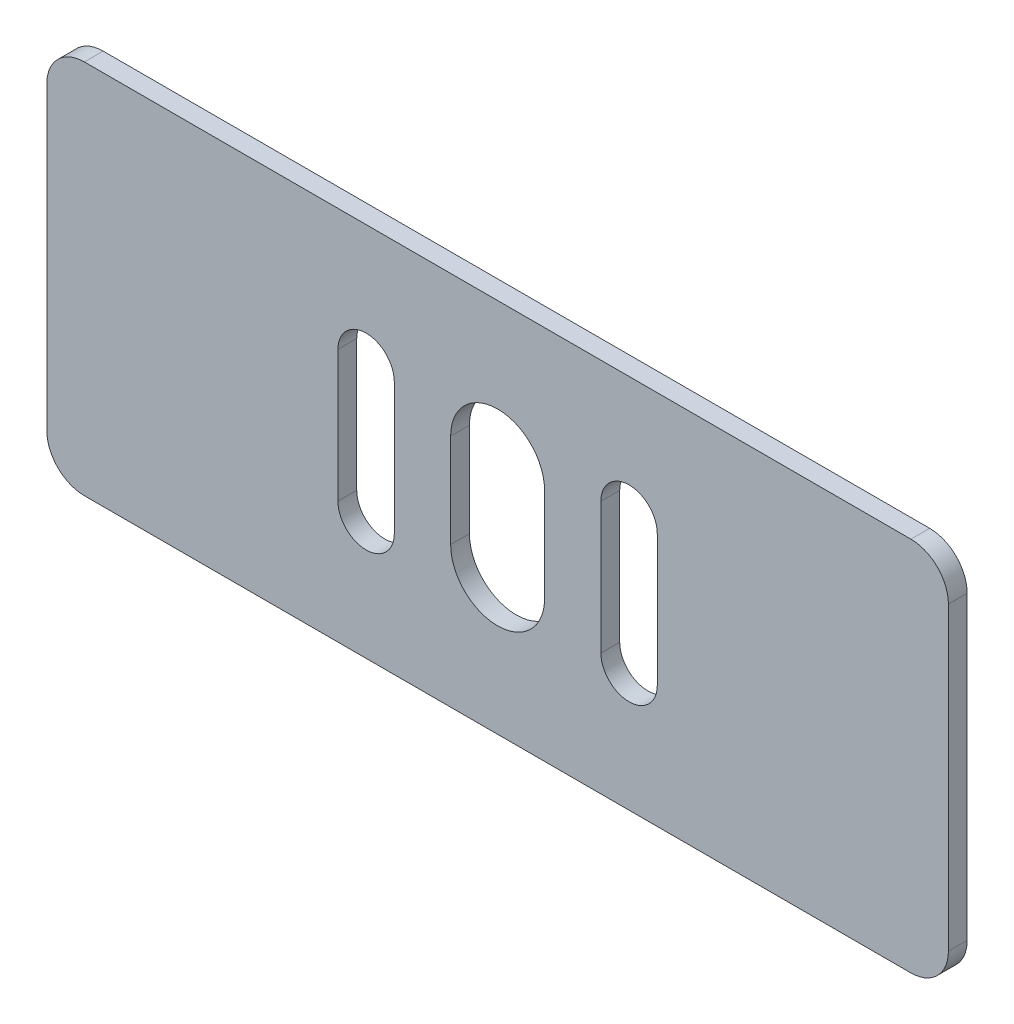
ISO-10303-21;
HEADER;
FILE_DESCRIPTION(('STEP AP214'),'2;1');
FILE_NAME('part.step','',(''),(''),'','','');
FILE_SCHEMA(('AUTOMOTIVE_DESIGN { 1 0 10303 214 1 1 1 1 }'));
ENDSEC;
DATA;
#1=APPLICATION_CONTEXT('core data for automotive mechanical design processes');
#2=APPLICATION_PROTOCOL_DEFINITION('international standard','automotive_design',2000,#1);
#3=PRODUCT_CONTEXT('',#1,'mechanical');
#4=PRODUCT('Part','Part','',(#3));
#5=PRODUCT_RELATED_PRODUCT_CATEGORY('part','',(#4));
#6=PRODUCT_DEFINITION_FORMATION('','',#4);
#7=PRODUCT_DEFINITION_CONTEXT('part definition',#1,'design');
#8=PRODUCT_DEFINITION('design','',#6,#7);
#9=PRODUCT_DEFINITION_SHAPE('','',#8);
#10=(LENGTH_UNIT() NAMED_UNIT(*) SI_UNIT(.MILLI.,.METRE.));
#11=(NAMED_UNIT(*) PLANE_ANGLE_UNIT() SI_UNIT($,.RADIAN.));
#12=(NAMED_UNIT(*) SI_UNIT($,.STERADIAN.) SOLID_ANGLE_UNIT());
#13=UNCERTAINTY_MEASURE_WITH_UNIT(LENGTH_MEASURE(1.E-05),#10,'distance_accuracy_value','');
#14=(GEOMETRIC_REPRESENTATION_CONTEXT(3) GLOBAL_UNCERTAINTY_ASSIGNED_CONTEXT((#13)) GLOBAL_UNIT_ASSIGNED_CONTEXT((#10,
#11,#12)) REPRESENTATION_CONTEXT('',''));
#15=CARTESIAN_POINT('',(0.,0.,0.));
#16=DIRECTION('',(0.,0.,1.));
#17=DIRECTION('',(1.,0.,0.));
#18=AXIS2_PLACEMENT_3D('',#15,#16,#17);
#19=CARTESIAN_POINT('',(-22.,8.,0.5));
#20=DIRECTION('',(0.,0.,1.));
#21=DIRECTION('',(1.,0.,0.));
#22=AXIS2_PLACEMENT_3D('',#19,#20,#21);
#23=PLANE('',#22);
#24=CARTESIAN_POINT('',(-22.,8.,0.5));
#25=DIRECTION('',(0.,0.,1.));
#26=DIRECTION('',(1.,0.,0.));
#27=AXIS2_PLACEMENT_3D('',#24,#25,#26);
#28=CIRCLE('',#27,2.);
#29=CARTESIAN_POINT('',(-22.,10.,0.5));
#30=VERTEX_POINT('',#29);
#31=CARTESIAN_POINT('',(-24.,7.99999999999998,0.5));
#32=VERTEX_POINT('',#31);
#33=EDGE_CURVE('E315',#30,#32,#28,.T.);
#34=ORIENTED_EDGE('',*,*,#33,.T.);
#35=DIRECTION('',(0.,-1.,0.));
#36=VECTOR('',#35,1.);
#37=CARTESIAN_POINT('',(-24.,-7.99999999999999,0.5));
#38=LINE('',#37,#36);
#39=CARTESIAN_POINT('',(-24.,-8.,0.5));
#40=VERTEX_POINT('',#39);
#41=EDGE_CURVE('E319',#32,#40,#38,.T.);
#42=ORIENTED_EDGE('',*,*,#41,.T.);
#43=CARTESIAN_POINT('',(-22.,-8.,0.5));
#44=DIRECTION('',(0.,0.,1.));
#45=DIRECTION('',(-1.,0.,0.));
#46=AXIS2_PLACEMENT_3D('',#43,#44,#45);
#47=CIRCLE('',#46,2.);
#48=CARTESIAN_POINT('',(-22.,-10.,0.5));
#49=VERTEX_POINT('',#48);
#50=EDGE_CURVE('E323',#40,#49,#47,.T.);
#51=ORIENTED_EDGE('',*,*,#50,.T.);
#52=DIRECTION('',(1.,0.,0.));
#53=VECTOR('',#52,1.);
#54=CARTESIAN_POINT('',(22.,-10.,0.5));
#55=LINE('',#54,#53);
#56=CARTESIAN_POINT('',(22.,-9.99999999999999,0.5));
#57=VERTEX_POINT('',#56);
#58=EDGE_CURVE('E326',#49,#57,#55,.T.);
#59=ORIENTED_EDGE('',*,*,#58,.T.);
#60=CARTESIAN_POINT('',(22.,-8.,0.5));
#61=DIRECTION('',(0.,0.,1.));
#62=DIRECTION('',(1.,0.,0.));
#63=AXIS2_PLACEMENT_3D('',#60,#61,#62);
#64=CIRCLE('',#63,2.);
#65=CARTESIAN_POINT('',(24.,-7.99999999999998,0.5));
#66=VERTEX_POINT('',#65);
#67=EDGE_CURVE('E329',#57,#66,#64,.T.);
#68=ORIENTED_EDGE('',*,*,#67,.T.);
#69=DIRECTION('',(0.,1.,0.));
#70=VECTOR('',#69,1.);
#71=CARTESIAN_POINT('',(24.,-7.99999999999998,0.5));
#72=LINE('',#71,#70);
#73=CARTESIAN_POINT('',(24.,7.99999999999999,0.5));
#74=VERTEX_POINT('',#73);
#75=EDGE_CURVE('E332',#66,#74,#72,.T.);
#76=ORIENTED_EDGE('',*,*,#75,.T.);
#77=CARTESIAN_POINT('',(22.,8.,0.5));
#78=DIRECTION('',(0.,0.,1.));
#79=DIRECTION('',(1.,0.,0.));
#80=AXIS2_PLACEMENT_3D('',#77,#78,#79);
#81=CIRCLE('',#80,2.);
#82=CARTESIAN_POINT('',(22.,10.,0.5));
#83=VERTEX_POINT('',#82);
#84=EDGE_CURVE('E335',#74,#83,#81,.T.);
#85=ORIENTED_EDGE('',*,*,#84,.T.);
#86=DIRECTION('',(-1.,0.,0.));
#87=VECTOR('',#86,1.);
#88=CARTESIAN_POINT('',(22.,10.,0.5));
#89=LINE('',#88,#87);
#90=EDGE_CURVE('E338',#83,#30,#89,.T.);
#91=ORIENTED_EDGE('',*,*,#90,.T.);
#92=EDGE_LOOP('',(#34,#42,#51,#59,#68,#76,#85,#91));
#93=FACE_BOUND('',#92,.T.);
#94=DIRECTION('',(0.,1.,0.));
#95=VECTOR('',#94,1.);
#96=CARTESIAN_POINT('',(2.50000000000001,-2.5,0.5));
#97=LINE('',#96,#95);
#98=CARTESIAN_POINT('',(2.50000000000001,-2.5,0.5));
#99=VERTEX_POINT('',#98);
#100=CARTESIAN_POINT('',(2.50000000000001,2.5,0.5));
#101=VERTEX_POINT('',#100);
#102=EDGE_CURVE('E275',#99,#101,#97,.T.);
#103=ORIENTED_EDGE('',*,*,#102,.F.);
#104=CARTESIAN_POINT('',(0.,-2.5,0.5));
#105=DIRECTION('',(0.,0.,1.));
#106=DIRECTION('',(1.,0.,0.));
#107=AXIS2_PLACEMENT_3D('',#104,#105,#106);
#108=CIRCLE('',#107,2.5);
#109=CARTESIAN_POINT('',(-2.49999999999999,-2.5,0.5));
#110=VERTEX_POINT('',#109);
#111=EDGE_CURVE('E272',#110,#99,#108,.T.);
#112=ORIENTED_EDGE('',*,*,#111,.F.);
#113=DIRECTION('',(0.,-1.,0.));
#114=VECTOR('',#113,1.);
#115=CARTESIAN_POINT('',(-2.49999999999999,-2.5,0.5));
#116=LINE('',#115,#114);
#117=CARTESIAN_POINT('',(-2.49999999999999,2.5,0.5));
#118=VERTEX_POINT('',#117);
#119=EDGE_CURVE('E283',#118,#110,#116,.T.);
#120=ORIENTED_EDGE('',*,*,#119,.F.);
#121=CARTESIAN_POINT('',(0.,2.5,0.5));
#122=DIRECTION('',(0.,0.,1.));
#123=DIRECTION('',(1.,0.,0.));
#124=AXIS2_PLACEMENT_3D('',#121,#122,#123);
#125=CIRCLE('',#124,2.5);
#126=EDGE_CURVE('E279',#101,#118,#125,.T.);
#127=ORIENTED_EDGE('',*,*,#126,.F.);
#128=EDGE_LOOP('',(#103,#112,#120,#127));
#129=FACE_BOUND('',#128,.T.);
#130=DIRECTION('',(0.,1.,0.));
#131=VECTOR('',#130,1.);
#132=CARTESIAN_POINT('',(-5.49999999999999,-3.5,0.5));
#133=LINE('',#132,#131);
#134=CARTESIAN_POINT('',(-5.49999999999999,-3.5,0.5));
#135=VERTEX_POINT('',#134);
#136=CARTESIAN_POINT('',(-5.49999999999999,3.5,0.5));
#137=VERTEX_POINT('',#136);
#138=EDGE_CURVE('E232',#135,#137,#133,.T.);
#139=ORIENTED_EDGE('',*,*,#138,.F.);
#140=CARTESIAN_POINT('',(-6.99999999999999,-3.5,0.5));
#141=DIRECTION('',(0.,0.,1.));
#142=DIRECTION('',(1.,0.,0.));
#143=AXIS2_PLACEMENT_3D('',#140,#141,#142);
#144=CIRCLE('',#143,1.5);
#145=CARTESIAN_POINT('',(-8.49999999999999,-3.5,0.5));
#146=VERTEX_POINT('',#145);
#147=EDGE_CURVE('E229',#146,#135,#144,.T.);
#148=ORIENTED_EDGE('',*,*,#147,.F.);
#149=DIRECTION('',(0.,-1.,0.));
#150=VECTOR('',#149,1.);
#151=CARTESIAN_POINT('',(-8.49999999999999,-3.5,0.5));
#152=LINE('',#151,#150);
#153=CARTESIAN_POINT('',(-8.49999999999999,3.5,0.5));
#154=VERTEX_POINT('',#153);
#155=EDGE_CURVE('E240',#154,#146,#152,.T.);
#156=ORIENTED_EDGE('',*,*,#155,.F.);
#157=CARTESIAN_POINT('',(-6.99999999999999,3.5,0.5));
#158=DIRECTION('',(0.,0.,1.));
#159=DIRECTION('',(1.,0.,0.));
#160=AXIS2_PLACEMENT_3D('',#157,#158,#159);
#161=CIRCLE('',#160,1.5);
#162=EDGE_CURVE('E236',#137,#154,#161,.T.);
#163=ORIENTED_EDGE('',*,*,#162,.F.);
#164=EDGE_LOOP('',(#139,#148,#156,#163));
#165=FACE_BOUND('',#164,.T.);
#166=DIRECTION('',(0.,1.,0.));
#167=VECTOR('',#166,1.);
#168=CARTESIAN_POINT('',(8.5,-3.5,0.5));
#169=LINE('',#168,#167);
#170=CARTESIAN_POINT('',(8.5,-3.5,0.5));
#171=VERTEX_POINT('',#170);
#172=CARTESIAN_POINT('',(8.5,3.5,0.5));
#173=VERTEX_POINT('',#172);
#174=EDGE_CURVE('E190',#171,#173,#169,.T.);
#175=ORIENTED_EDGE('',*,*,#174,.F.);
#176=CARTESIAN_POINT('',(7.,-3.5,0.5));
#177=DIRECTION('',(0.,0.,1.));
#178=DIRECTION('',(1.,0.,0.));
#179=AXIS2_PLACEMENT_3D('',#176,#177,#178);
#180=CIRCLE('',#179,1.5);
#181=CARTESIAN_POINT('',(5.5,-3.5,0.5));
#182=VERTEX_POINT('',#181);
#183=EDGE_CURVE('E181',#182,#171,#180,.T.);
#184=ORIENTED_EDGE('',*,*,#183,.F.);
#185=DIRECTION('',(0.,-1.,0.));
#186=VECTOR('',#185,1.);
#187=CARTESIAN_POINT('',(5.5,-3.5,0.5));
#188=LINE('',#187,#186);
#189=CARTESIAN_POINT('',(5.50000000000001,3.5,0.5));
#190=VERTEX_POINT('',#189);
#191=EDGE_CURVE('E207',#190,#182,#188,.T.);
#192=ORIENTED_EDGE('',*,*,#191,.F.);
#193=CARTESIAN_POINT('',(7.,3.5,0.5));
#194=DIRECTION('',(0.,0.,1.));
#195=DIRECTION('',(1.,0.,0.));
#196=AXIS2_PLACEMENT_3D('',#193,#194,#195);
#197=CIRCLE('',#196,1.5);
#198=EDGE_CURVE('E203',#173,#190,#197,.T.);
#199=ORIENTED_EDGE('',*,*,#198,.F.);
#200=EDGE_LOOP('',(#175,#184,#192,#199));
#201=FACE_BOUND('',#200,.T.);
#202=ADVANCED_FACE('F43',(#93,#129,#165,#201),#23,.T.);
#203=CARTESIAN_POINT('',(-22.,8.,-0.5));
#204=DIRECTION('',(0.,0.,1.));
#205=DIRECTION('',(1.,0.,0.));
#206=AXIS2_PLACEMENT_3D('',#203,#204,#205);
#207=PLANE('',#206);
#208=CARTESIAN_POINT('',(-6.99999999999999,-3.5,-0.5));
#209=DIRECTION('',(0.,0.,1.));
#210=DIRECTION('',(1.,0.,0.));
#211=AXIS2_PLACEMENT_3D('',#208,#209,#210);
#212=CIRCLE('',#211,1.5);
#213=CARTESIAN_POINT('',(-8.49999999999999,-3.5,-0.5));
#214=VERTEX_POINT('',#213);
#215=CARTESIAN_POINT('',(-5.49999999999999,-3.5,-0.5));
#216=VERTEX_POINT('',#215);
#217=EDGE_CURVE('E199',#214,#216,#212,.T.);
#218=ORIENTED_EDGE('',*,*,#217,.T.);
#219=DIRECTION('',(0.,1.,0.));
#220=VECTOR('',#219,1.);
#221=CARTESIAN_POINT('',(-5.49999999999999,-3.5,-0.5));
#222=LINE('',#221,#220);
#223=CARTESIAN_POINT('',(-5.49999999999999,3.5,-0.5));
#224=VERTEX_POINT('',#223);
#225=EDGE_CURVE('E247',#216,#224,#222,.T.);
#226=ORIENTED_EDGE('',*,*,#225,.T.);
#227=CARTESIAN_POINT('',(-6.99999999999999,3.5,-0.5));
#228=DIRECTION('',(0.,0.,1.));
#229=DIRECTION('',(1.,0.,0.));
#230=AXIS2_PLACEMENT_3D('',#227,#228,#229);
#231=CIRCLE('',#230,1.5);
#232=CARTESIAN_POINT('',(-8.49999999999999,3.5,-0.5));
#233=VERTEX_POINT('',#232);
#234=EDGE_CURVE('E251',#224,#233,#231,.T.);
#235=ORIENTED_EDGE('',*,*,#234,.T.);
#236=DIRECTION('',(0.,-1.,0.));
#237=VECTOR('',#236,1.);
#238=CARTESIAN_POINT('',(-8.49999999999999,-3.5,-0.5));
#239=LINE('',#238,#237);
#240=EDGE_CURVE('E233',#233,#214,#239,.T.);
#241=ORIENTED_EDGE('',*,*,#240,.T.);
#242=EDGE_LOOP('',(#218,#226,#235,#241));
#243=FACE_BOUND('',#242,.T.);
#244=CARTESIAN_POINT('',(-22.,8.,-0.5));
#245=DIRECTION('',(0.,0.,1.));
#246=DIRECTION('',(1.,0.,0.));
#247=AXIS2_PLACEMENT_3D('',#244,#245,#246);
#248=CIRCLE('',#247,2.);
#249=CARTESIAN_POINT('',(-22.,10.,-0.5));
#250=VERTEX_POINT('',#249);
#251=CARTESIAN_POINT('',(-24.,7.99999999999998,-0.5));
#252=VERTEX_POINT('',#251);
#253=EDGE_CURVE('E314',#250,#252,#248,.T.);
#254=ORIENTED_EDGE('',*,*,#253,.F.);
#255=DIRECTION('',(-1.,0.,0.));
#256=VECTOR('',#255,1.);
#257=CARTESIAN_POINT('',(22.,10.,-0.5));
#258=LINE('',#257,#256);
#259=CARTESIAN_POINT('',(22.,10.,-0.5));
#260=VERTEX_POINT('',#259);
#261=EDGE_CURVE('E320',#260,#250,#258,.T.);
#262=ORIENTED_EDGE('',*,*,#261,.F.);
#263=CARTESIAN_POINT('',(22.,8.,-0.5));
#264=DIRECTION('',(0.,0.,1.));
#265=DIRECTION('',(1.,0.,0.));
#266=AXIS2_PLACEMENT_3D('',#263,#264,#265);
#267=CIRCLE('',#266,2.);
#268=CARTESIAN_POINT('',(24.,7.99999999999999,-0.5));
#269=VERTEX_POINT('',#268);
#270=EDGE_CURVE('E360',#269,#260,#267,.T.);
#271=ORIENTED_EDGE('',*,*,#270,.F.);
#272=DIRECTION('',(0.,1.,0.));
#273=VECTOR('',#272,1.);
#274=CARTESIAN_POINT('',(24.,-7.99999999999998,-0.5));
#275=LINE('',#274,#273);
#276=CARTESIAN_POINT('',(24.,-7.99999999999998,-0.5));
#277=VERTEX_POINT('',#276);
#278=EDGE_CURVE('E357',#277,#269,#275,.T.);
#279=ORIENTED_EDGE('',*,*,#278,.F.);
#280=CARTESIAN_POINT('',(22.,-8.,-0.5));
#281=DIRECTION('',(0.,0.,1.));
#282=DIRECTION('',(1.,0.,0.));
#283=AXIS2_PLACEMENT_3D('',#280,#281,#282);
#284=CIRCLE('',#283,2.);
#285=CARTESIAN_POINT('',(22.,-9.99999999999999,-0.5));
#286=VERTEX_POINT('',#285);
#287=EDGE_CURVE('E354',#286,#277,#284,.T.);
#288=ORIENTED_EDGE('',*,*,#287,.F.);
#289=DIRECTION('',(1.,0.,0.));
#290=VECTOR('',#289,1.);
#291=CARTESIAN_POINT('',(22.,-10.,-0.5));
#292=LINE('',#291,#290);
#293=CARTESIAN_POINT('',(-22.,-10.,-0.5));
#294=VERTEX_POINT('',#293);
#295=EDGE_CURVE('E351',#294,#286,#292,.T.);
#296=ORIENTED_EDGE('',*,*,#295,.F.);
#297=CARTESIAN_POINT('',(-22.,-8.,-0.5));
#298=DIRECTION('',(0.,0.,1.));
#299=DIRECTION('',(-1.,0.,0.));
#300=AXIS2_PLACEMENT_3D('',#297,#298,#299);
#301=CIRCLE('',#300,2.);
#302=CARTESIAN_POINT('',(-24.,-8.,-0.5));
#303=VERTEX_POINT('',#302);
#304=EDGE_CURVE('E348',#303,#294,#301,.T.);
#305=ORIENTED_EDGE('',*,*,#304,.F.);
#306=DIRECTION('',(0.,-1.,0.));
#307=VECTOR('',#306,1.);
#308=CARTESIAN_POINT('',(-24.,-7.99999999999999,-0.5));
#309=LINE('',#308,#307);
#310=EDGE_CURVE('E345',#252,#303,#309,.T.);
#311=ORIENTED_EDGE('',*,*,#310,.F.);
#312=EDGE_LOOP('',(#254,#262,#271,#279,#288,#296,#305,#311));
#313=FACE_BOUND('',#312,.T.);
#314=CARTESIAN_POINT('',(0.,-2.5,-0.5));
#315=DIRECTION('',(0.,0.,1.));
#316=DIRECTION('',(1.,0.,0.));
#317=AXIS2_PLACEMENT_3D('',#314,#315,#316);
#318=CIRCLE('',#317,2.5);
#319=CARTESIAN_POINT('',(-2.49999999999999,-2.5,-0.5));
#320=VERTEX_POINT('',#319);
#321=CARTESIAN_POINT('',(2.50000000000001,-2.5,-0.5));
#322=VERTEX_POINT('',#321);
#323=EDGE_CURVE('E271',#320,#322,#318,.T.);
#324=ORIENTED_EDGE('',*,*,#323,.T.);
#325=DIRECTION('',(0.,1.,0.));
#326=VECTOR('',#325,1.);
#327=CARTESIAN_POINT('',(2.50000000000001,-2.5,-0.5));
#328=LINE('',#327,#326);
#329=CARTESIAN_POINT('',(2.50000000000001,2.5,-0.5));
#330=VERTEX_POINT('',#329);
#331=EDGE_CURVE('E290',#322,#330,#328,.T.);
#332=ORIENTED_EDGE('',*,*,#331,.T.);
#333=CARTESIAN_POINT('',(0.,2.5,-0.5));
#334=DIRECTION('',(0.,0.,1.));
#335=DIRECTION('',(1.,0.,0.));
#336=AXIS2_PLACEMENT_3D('',#333,#334,#335);
#337=CIRCLE('',#336,2.5);
#338=CARTESIAN_POINT('',(-2.49999999999999,2.5,-0.5));
#339=VERTEX_POINT('',#338);
#340=EDGE_CURVE('E294',#330,#339,#337,.T.);
#341=ORIENTED_EDGE('',*,*,#340,.T.);
#342=DIRECTION('',(0.,-1.,0.));
#343=VECTOR('',#342,1.);
#344=CARTESIAN_POINT('',(-2.49999999999999,-2.5,-0.5));
#345=LINE('',#344,#343);
#346=EDGE_CURVE('E276',#339,#320,#345,.T.);
#347=ORIENTED_EDGE('',*,*,#346,.T.);
#348=EDGE_LOOP('',(#324,#332,#341,#347));
#349=FACE_BOUND('',#348,.T.);
#350=CARTESIAN_POINT('',(7.,-3.5,-0.5));
#351=DIRECTION('',(0.,0.,1.));
#352=DIRECTION('',(1.,0.,0.));
#353=AXIS2_PLACEMENT_3D('',#350,#351,#352);
#354=CIRCLE('',#353,1.5);
#355=CARTESIAN_POINT('',(5.50000000000001,-3.5,-0.5));
#356=VERTEX_POINT('',#355);
#357=CARTESIAN_POINT('',(8.5,-3.5,-0.5));
#358=VERTEX_POINT('',#357);
#359=EDGE_CURVE('E67',#356,#358,#354,.T.);
#360=ORIENTED_EDGE('',*,*,#359,.T.);
#361=DIRECTION('',(0.,1.,0.));
#362=VECTOR('',#361,1.);
#363=CARTESIAN_POINT('',(8.5,-3.5,-0.5));
#364=LINE('',#363,#362);
#365=CARTESIAN_POINT('',(8.5,3.5,-0.5));
#366=VERTEX_POINT('',#365);
#367=EDGE_CURVE('E197',#358,#366,#364,.T.);
#368=ORIENTED_EDGE('',*,*,#367,.T.);
#369=CARTESIAN_POINT('',(7.,3.5,-0.5));
#370=DIRECTION('',(0.,0.,1.));
#371=DIRECTION('',(1.,0.,0.));
#372=AXIS2_PLACEMENT_3D('',#369,#370,#371);
#373=CIRCLE('',#372,1.5);
#374=CARTESIAN_POINT('',(5.5,3.5,-0.5));
#375=VERTEX_POINT('',#374);
#376=EDGE_CURVE('E216',#366,#375,#373,.T.);
#377=ORIENTED_EDGE('',*,*,#376,.T.);
#378=DIRECTION('',(0.,-1.,0.));
#379=VECTOR('',#378,1.);
#380=CARTESIAN_POINT('',(5.5,-3.5,-0.5));
#381=LINE('',#380,#379);
#382=EDGE_CURVE('E191',#375,#356,#381,.T.);
#383=ORIENTED_EDGE('',*,*,#382,.T.);
#384=EDGE_LOOP('',(#360,#368,#377,#383));
#385=FACE_BOUND('',#384,.T.);
#386=ADVANCED_FACE('F399',(#243,#313,#349,#385),#207,.F.);
#387=CARTESIAN_POINT('',(-22.,8.,0.5));
#388=DIRECTION('',(0.,0.,-1.));
#389=DIRECTION('',(-1.,0.,0.));
#390=AXIS2_PLACEMENT_3D('',#387,#388,#389);
#391=CYLINDRICAL_SURFACE('',#390,2.);
#392=ORIENTED_EDGE('',*,*,#253,.T.);
#393=DIRECTION('',(0.,0.,-1.));
#394=VECTOR('',#393,1.);
#395=CARTESIAN_POINT('',(-24.,7.99999999999998,0.5));
#396=LINE('',#395,#394);
#397=EDGE_CURVE('E11',#32,#252,#396,.T.);
#398=ORIENTED_EDGE('',*,*,#397,.F.);
#399=ORIENTED_EDGE('',*,*,#33,.F.);
#400=DIRECTION('',(0.,0.,-1.));
#401=VECTOR('',#400,1.);
#402=CARTESIAN_POINT('',(-22.,10.,0.5));
#403=LINE('',#402,#401);
#404=EDGE_CURVE('E341',#30,#250,#403,.T.);
#405=ORIENTED_EDGE('',*,*,#404,.T.);
#406=EDGE_LOOP('',(#392,#398,#399,#405));
#407=FACE_BOUND('',#406,.T.);
#408=ADVANCED_FACE('F45',(#407),#391,.T.);
#409=CARTESIAN_POINT('',(-24.,-7.99999999999999,0.5));
#410=DIRECTION('',(1.,0.,0.));
#411=DIRECTION('',(0.,0.,-1.));
#412=AXIS2_PLACEMENT_3D('',#409,#410,#411);
#413=PLANE('',#412);
#414=ORIENTED_EDGE('',*,*,#310,.T.);
#415=DIRECTION('',(0.,0.,-1.));
#416=VECTOR('',#415,1.);
#417=CARTESIAN_POINT('',(-24.,-8.,0.5));
#418=LINE('',#417,#416);
#419=EDGE_CURVE('E52',#40,#303,#418,.T.);
#420=ORIENTED_EDGE('',*,*,#419,.F.);
#421=ORIENTED_EDGE('',*,*,#41,.F.);
#422=ORIENTED_EDGE('',*,*,#397,.T.);
#423=EDGE_LOOP('',(#414,#420,#421,#422));
#424=FACE_BOUND('',#423,.T.);
#425=ADVANCED_FACE('F417',(#424),#413,.F.);
#426=CARTESIAN_POINT('',(-22.,-8.,0.5));
#427=DIRECTION('',(0.,0.,-1.));
#428=DIRECTION('',(-1.,0.,0.));
#429=AXIS2_PLACEMENT_3D('',#426,#427,#428);
#430=CYLINDRICAL_SURFACE('',#429,2.);
#431=ORIENTED_EDGE('',*,*,#304,.T.);
#432=DIRECTION('',(0.,0.,-1.));
#433=VECTOR('',#432,1.);
#434=CARTESIAN_POINT('',(-22.,-10.,0.5));
#435=LINE('',#434,#433);
#436=EDGE_CURVE('E384',#49,#294,#435,.T.);
#437=ORIENTED_EDGE('',*,*,#436,.F.);
#438=ORIENTED_EDGE('',*,*,#50,.F.);
#439=ORIENTED_EDGE('',*,*,#419,.T.);
#440=EDGE_LOOP('',(#431,#437,#438,#439));
#441=FACE_BOUND('',#440,.T.);
#442=ADVANCED_FACE('F393',(#441),#430,.T.);
#443=CARTESIAN_POINT('',(22.,-10.,0.5));
#444=DIRECTION('',(0.,1.,0.));
#445=DIRECTION('',(-1.,0.,0.));
#446=AXIS2_PLACEMENT_3D('',#443,#444,#445);
#447=PLANE('',#446);
#448=ORIENTED_EDGE('',*,*,#295,.T.);
#449=DIRECTION('',(0.,0.,-1.));
#450=VECTOR('',#449,1.);
#451=CARTESIAN_POINT('',(22.,-9.99999999999999,0.5));
#452=LINE('',#451,#450);
#453=EDGE_CURVE('E380',#57,#286,#452,.T.);
#454=ORIENTED_EDGE('',*,*,#453,.F.);
#455=ORIENTED_EDGE('',*,*,#58,.F.);
#456=ORIENTED_EDGE('',*,*,#436,.T.);
#457=EDGE_LOOP('',(#448,#454,#455,#456));
#458=FACE_BOUND('',#457,.T.);
#459=ADVANCED_FACE('F405',(#458),#447,.F.);
#460=CARTESIAN_POINT('',(22.,-8.,0.5));
#461=DIRECTION('',(0.,0.,-1.));
#462=DIRECTION('',(-1.,0.,0.));
#463=AXIS2_PLACEMENT_3D('',#460,#461,#462);
#464=CYLINDRICAL_SURFACE('',#463,2.);
#465=ORIENTED_EDGE('',*,*,#287,.T.);
#466=DIRECTION('',(0.,0.,-1.));
#467=VECTOR('',#466,1.);
#468=CARTESIAN_POINT('',(24.,-7.99999999999998,0.5));
#469=LINE('',#468,#467);
#470=EDGE_CURVE('E376',#66,#277,#469,.T.);
#471=ORIENTED_EDGE('',*,*,#470,.F.);
#472=ORIENTED_EDGE('',*,*,#67,.F.);
#473=ORIENTED_EDGE('',*,*,#453,.T.);
#474=EDGE_LOOP('',(#465,#471,#472,#473));
#475=FACE_BOUND('',#474,.T.);
#476=ADVANCED_FACE('F409',(#475),#464,.T.);
#477=CARTESIAN_POINT('',(24.,-7.99999999999998,0.5));
#478=DIRECTION('',(-1.,0.,0.));
#479=DIRECTION('',(0.,0.,1.));
#480=AXIS2_PLACEMENT_3D('',#477,#478,#479);
#481=PLANE('',#480);
#482=ORIENTED_EDGE('',*,*,#278,.T.);
#483=DIRECTION('',(0.,0.,-1.));
#484=VECTOR('',#483,1.);
#485=CARTESIAN_POINT('',(24.,7.99999999999999,0.5));
#486=LINE('',#485,#484);
#487=EDGE_CURVE('E372',#74,#269,#486,.T.);
#488=ORIENTED_EDGE('',*,*,#487,.F.);
#489=ORIENTED_EDGE('',*,*,#75,.F.);
#490=ORIENTED_EDGE('',*,*,#470,.T.);
#491=EDGE_LOOP('',(#482,#488,#489,#490));
#492=FACE_BOUND('',#491,.T.);
#493=ADVANCED_FACE('F430',(#492),#481,.F.);
#494=CARTESIAN_POINT('',(22.,8.,0.5));
#495=DIRECTION('',(0.,0.,-1.));
#496=DIRECTION('',(-1.,0.,0.));
#497=AXIS2_PLACEMENT_3D('',#494,#495,#496);
#498=CYLINDRICAL_SURFACE('',#497,2.);
#499=ORIENTED_EDGE('',*,*,#270,.T.);
#500=DIRECTION('',(0.,0.,-1.));
#501=VECTOR('',#500,1.);
#502=CARTESIAN_POINT('',(22.,10.,0.5));
#503=LINE('',#502,#501);
#504=EDGE_CURVE('E368',#83,#260,#503,.T.);
#505=ORIENTED_EDGE('',*,*,#504,.F.);
#506=ORIENTED_EDGE('',*,*,#84,.F.);
#507=ORIENTED_EDGE('',*,*,#487,.T.);
#508=EDGE_LOOP('',(#499,#505,#506,#507));
#509=FACE_BOUND('',#508,.T.);
#510=ADVANCED_FACE('F428',(#509),#498,.T.);
#511=CARTESIAN_POINT('',(22.,10.,0.5));
#512=DIRECTION('',(0.,-1.,0.));
#513=DIRECTION('',(1.,0.,0.));
#514=AXIS2_PLACEMENT_3D('',#511,#512,#513);
#515=PLANE('',#514);
#516=ORIENTED_EDGE('',*,*,#261,.T.);
#517=ORIENTED_EDGE('',*,*,#404,.F.);
#518=ORIENTED_EDGE('',*,*,#90,.F.);
#519=ORIENTED_EDGE('',*,*,#504,.T.);
#520=EDGE_LOOP('',(#516,#517,#518,#519));
#521=FACE_BOUND('',#520,.T.);
#522=ADVANCED_FACE('F423',(#521),#515,.F.);
#523=CARTESIAN_POINT('',(0.,-2.5,0.5));
#524=DIRECTION('',(0.,0.,-1.));
#525=DIRECTION('',(-1.,0.,0.));
#526=AXIS2_PLACEMENT_3D('',#523,#524,#525);
#527=CYLINDRICAL_SURFACE('',#526,2.5);
#528=ORIENTED_EDGE('',*,*,#323,.F.);
#529=DIRECTION('',(0.,0.,-1.));
#530=VECTOR('',#529,1.);
#531=CARTESIAN_POINT('',(-2.49999999999999,-2.5,0.5));
#532=LINE('',#531,#530);
#533=EDGE_CURVE('E286',#110,#320,#532,.T.);
#534=ORIENTED_EDGE('',*,*,#533,.F.);
#535=ORIENTED_EDGE('',*,*,#111,.T.);
#536=DIRECTION('',(0.,0.,-1.));
#537=VECTOR('',#536,1.);
#538=CARTESIAN_POINT('',(2.50000000000001,-2.5,0.5));
#539=LINE('',#538,#537);
#540=EDGE_CURVE('E310',#99,#322,#539,.T.);
#541=ORIENTED_EDGE('',*,*,#540,.T.);
#542=EDGE_LOOP('',(#528,#534,#535,#541));
#543=FACE_BOUND('',#542,.T.);
#544=ADVANCED_FACE('F447',(#543),#527,.F.);
#545=CARTESIAN_POINT('',(2.50000000000001,-2.5,0.5));
#546=DIRECTION('',(-1.,0.,0.));
#547=DIRECTION('',(0.,-1.,0.));
#548=AXIS2_PLACEMENT_3D('',#545,#546,#547);
#549=PLANE('',#548);
#550=ORIENTED_EDGE('',*,*,#331,.F.);
#551=ORIENTED_EDGE('',*,*,#540,.F.);
#552=ORIENTED_EDGE('',*,*,#102,.T.);
#553=DIRECTION('',(0.,0.,-1.));
#554=VECTOR('',#553,1.);
#555=CARTESIAN_POINT('',(2.50000000000001,2.5,0.5));
#556=LINE('',#555,#554);
#557=EDGE_CURVE('E307',#101,#330,#556,.T.);
#558=ORIENTED_EDGE('',*,*,#557,.T.);
#559=EDGE_LOOP('',(#550,#551,#552,#558));
#560=FACE_BOUND('',#559,.T.);
#561=ADVANCED_FACE('F454',(#560),#549,.T.);
#562=CARTESIAN_POINT('',(0.,2.5,0.5));
#563=DIRECTION('',(0.,0.,-1.));
#564=DIRECTION('',(-1.,0.,0.));
#565=AXIS2_PLACEMENT_3D('',#562,#563,#564);
#566=CYLINDRICAL_SURFACE('',#565,2.5);
#567=ORIENTED_EDGE('',*,*,#340,.F.);
#568=ORIENTED_EDGE('',*,*,#557,.F.);
#569=ORIENTED_EDGE('',*,*,#126,.T.);
#570=DIRECTION('',(0.,0.,-1.));
#571=VECTOR('',#570,1.);
#572=CARTESIAN_POINT('',(-2.49999999999999,2.5,0.5));
#573=LINE('',#572,#571);
#574=EDGE_CURVE('E304',#118,#339,#573,.T.);
#575=ORIENTED_EDGE('',*,*,#574,.T.);
#576=EDGE_LOOP('',(#567,#568,#569,#575));
#577=FACE_BOUND('',#576,.T.);
#578=ADVANCED_FACE('F459',(#577),#566,.F.);
#579=CARTESIAN_POINT('',(-2.49999999999999,-2.5,0.5));
#580=DIRECTION('',(1.,0.,0.));
#581=DIRECTION('',(0.,1.,0.));
#582=AXIS2_PLACEMENT_3D('',#579,#580,#581);
#583=PLANE('',#582);
#584=ORIENTED_EDGE('',*,*,#346,.F.);
#585=ORIENTED_EDGE('',*,*,#574,.F.);
#586=ORIENTED_EDGE('',*,*,#119,.T.);
#587=ORIENTED_EDGE('',*,*,#533,.T.);
#588=EDGE_LOOP('',(#584,#585,#586,#587));
#589=FACE_BOUND('',#588,.T.);
#590=ADVANCED_FACE('F466',(#589),#583,.T.);
#591=CARTESIAN_POINT('',(-6.99999999999999,-3.5,0.5));
#592=DIRECTION('',(0.,0.,-1.));
#593=DIRECTION('',(-1.,0.,0.));
#594=AXIS2_PLACEMENT_3D('',#591,#592,#593);
#595=CYLINDRICAL_SURFACE('',#594,1.5);
#596=ORIENTED_EDGE('',*,*,#217,.F.);
#597=DIRECTION('',(0.,0.,-1.));
#598=VECTOR('',#597,1.);
#599=CARTESIAN_POINT('',(-8.49999999999999,-3.5,0.5));
#600=LINE('',#599,#598);
#601=EDGE_CURVE('E243',#146,#214,#600,.T.);
#602=ORIENTED_EDGE('',*,*,#601,.F.);
#603=ORIENTED_EDGE('',*,*,#147,.T.);
#604=DIRECTION('',(0.,0.,-1.));
#605=VECTOR('',#604,1.);
#606=CARTESIAN_POINT('',(-5.49999999999999,-3.5,0.5));
#607=LINE('',#606,#605);
#608=EDGE_CURVE('E267',#135,#216,#607,.T.);
#609=ORIENTED_EDGE('',*,*,#608,.T.);
#610=EDGE_LOOP('',(#596,#602,#603,#609));
#611=FACE_BOUND('',#610,.T.);
#612=ADVANCED_FACE('F488',(#611),#595,.F.);
#613=CARTESIAN_POINT('',(-5.49999999999999,-3.5,0.5));
#614=DIRECTION('',(-1.,0.,0.));
#615=DIRECTION('',(0.,0.,1.));
#616=AXIS2_PLACEMENT_3D('',#613,#614,#615);
#617=PLANE('',#616);
#618=ORIENTED_EDGE('',*,*,#225,.F.);
#619=ORIENTED_EDGE('',*,*,#608,.F.);
#620=ORIENTED_EDGE('',*,*,#138,.T.);
#621=DIRECTION('',(0.,0.,-1.));
#622=VECTOR('',#621,1.);
#623=CARTESIAN_POINT('',(-5.49999999999999,3.5,0.5));
#624=LINE('',#623,#622);
#625=EDGE_CURVE('E264',#137,#224,#624,.T.);
#626=ORIENTED_EDGE('',*,*,#625,.T.);
#627=EDGE_LOOP('',(#618,#619,#620,#626));
#628=FACE_BOUND('',#627,.T.);
#629=ADVANCED_FACE('F482',(#628),#617,.T.);
#630=CARTESIAN_POINT('',(-6.99999999999999,3.5,0.5));
#631=DIRECTION('',(0.,0.,-1.));
#632=DIRECTION('',(-1.,0.,0.));
#633=AXIS2_PLACEMENT_3D('',#630,#631,#632);
#634=CYLINDRICAL_SURFACE('',#633,1.5);
#635=ORIENTED_EDGE('',*,*,#234,.F.);
#636=ORIENTED_EDGE('',*,*,#625,.F.);
#637=ORIENTED_EDGE('',*,*,#162,.T.);
#638=DIRECTION('',(0.,0.,-1.));
#639=VECTOR('',#638,1.);
#640=CARTESIAN_POINT('',(-8.49999999999999,3.5,0.5));
#641=LINE('',#640,#639);
#642=EDGE_CURVE('E261',#154,#233,#641,.T.);
#643=ORIENTED_EDGE('',*,*,#642,.T.);
#644=EDGE_LOOP('',(#635,#636,#637,#643));
#645=FACE_BOUND('',#644,.T.);
#646=ADVANCED_FACE('F485',(#645),#634,.F.);
#647=CARTESIAN_POINT('',(-8.49999999999999,-3.5,0.5));
#648=DIRECTION('',(1.,0.,0.));
#649=DIRECTION('',(0.,0.,-1.));
#650=AXIS2_PLACEMENT_3D('',#647,#648,#649);
#651=PLANE('',#650);
#652=ORIENTED_EDGE('',*,*,#240,.F.);
#653=ORIENTED_EDGE('',*,*,#642,.F.);
#654=ORIENTED_EDGE('',*,*,#155,.T.);
#655=ORIENTED_EDGE('',*,*,#601,.T.);
#656=EDGE_LOOP('',(#652,#653,#654,#655));
#657=FACE_BOUND('',#656,.T.);
#658=ADVANCED_FACE('F491',(#657),#651,.T.);
#659=CARTESIAN_POINT('',(7.,-3.5,0.5));
#660=DIRECTION('',(0.,0.,-1.));
#661=DIRECTION('',(-1.,0.,0.));
#662=AXIS2_PLACEMENT_3D('',#659,#660,#661);
#663=CYLINDRICAL_SURFACE('',#662,1.5);
#664=ORIENTED_EDGE('',*,*,#359,.F.);
#665=DIRECTION('',(0.,0.,-1.));
#666=VECTOR('',#665,1.);
#667=CARTESIAN_POINT('',(5.5,-3.5,0.5));
#668=LINE('',#667,#666);
#669=EDGE_CURVE('E185',#182,#356,#668,.T.);
#670=ORIENTED_EDGE('',*,*,#669,.F.);
#671=ORIENTED_EDGE('',*,*,#183,.T.);
#672=DIRECTION('',(0.,0.,-1.));
#673=VECTOR('',#672,1.);
#674=CARTESIAN_POINT('',(8.5,-3.5,0.5));
#675=LINE('',#674,#673);
#676=EDGE_CURVE('E184',#171,#358,#675,.T.);
#677=ORIENTED_EDGE('',*,*,#676,.T.);
#678=EDGE_LOOP('',(#664,#670,#671,#677));
#679=FACE_BOUND('',#678,.T.);
#680=ADVANCED_FACE('F183',(#679),#663,.F.);
#681=CARTESIAN_POINT('',(8.5,-3.5,0.5));
#682=DIRECTION('',(-1.,0.,0.));
#683=DIRECTION('',(0.,0.,1.));
#684=AXIS2_PLACEMENT_3D('',#681,#682,#683);
#685=PLANE('',#684);
#686=ORIENTED_EDGE('',*,*,#367,.F.);
#687=ORIENTED_EDGE('',*,*,#676,.F.);
#688=ORIENTED_EDGE('',*,*,#174,.T.);
#689=DIRECTION('',(0.,0.,-1.));
#690=VECTOR('',#689,1.);
#691=CARTESIAN_POINT('',(8.5,3.5,0.5));
#692=LINE('',#691,#690);
#693=EDGE_CURVE('E200',#173,#366,#692,.T.);
#694=ORIENTED_EDGE('',*,*,#693,.T.);
#695=EDGE_LOOP('',(#686,#687,#688,#694));
#696=FACE_BOUND('',#695,.T.);
#697=ADVANCED_FACE('F194',(#696),#685,.T.);
#698=CARTESIAN_POINT('',(7.,3.5,0.5));
#699=DIRECTION('',(0.,0.,-1.));
#700=DIRECTION('',(-1.,0.,0.));
#701=AXIS2_PLACEMENT_3D('',#698,#699,#700);
#702=CYLINDRICAL_SURFACE('',#701,1.5);
#703=ORIENTED_EDGE('',*,*,#376,.F.);
#704=ORIENTED_EDGE('',*,*,#693,.F.);
#705=ORIENTED_EDGE('',*,*,#198,.T.);
#706=DIRECTION('',(0.,0.,-1.));
#707=VECTOR('',#706,1.);
#708=CARTESIAN_POINT('',(5.5,3.5,0.5));
#709=LINE('',#708,#707);
#710=EDGE_CURVE('E59',#190,#375,#709,.T.);
#711=ORIENTED_EDGE('',*,*,#710,.T.);
#712=EDGE_LOOP('',(#703,#704,#705,#711));
#713=FACE_BOUND('',#712,.T.);
#714=ADVANCED_FACE('F551',(#713),#702,.F.);
#715=CARTESIAN_POINT('',(5.5,-3.5,0.5));
#716=DIRECTION('',(1.,0.,0.));
#717=DIRECTION('',(0.,0.,-1.));
#718=AXIS2_PLACEMENT_3D('',#715,#716,#717);
#719=PLANE('',#718);
#720=ORIENTED_EDGE('',*,*,#382,.F.);
#721=ORIENTED_EDGE('',*,*,#710,.F.);
#722=ORIENTED_EDGE('',*,*,#191,.T.);
#723=ORIENTED_EDGE('',*,*,#669,.T.);
#724=EDGE_LOOP('',(#720,#721,#722,#723));
#725=FACE_BOUND('',#724,.T.);
#726=ADVANCED_FACE('F560',(#725),#719,.T.);
#727=CLOSED_SHELL('',(#202,#386,#408,#425,#442,#459,#476,#493,#510,#522,#544,#561,#578,#590,
#612,#629,#646,#658,#680,#697,#714,#726));
#728=MANIFOLD_SOLID_BREP('B2',#727);
#729=ADVANCED_BREP_SHAPE_REPRESENTATION('',(#18,#728),#14);
#730=SHAPE_DEFINITION_REPRESENTATION(#9,#729);
ENDSEC;
END-ISO-10303-21;
